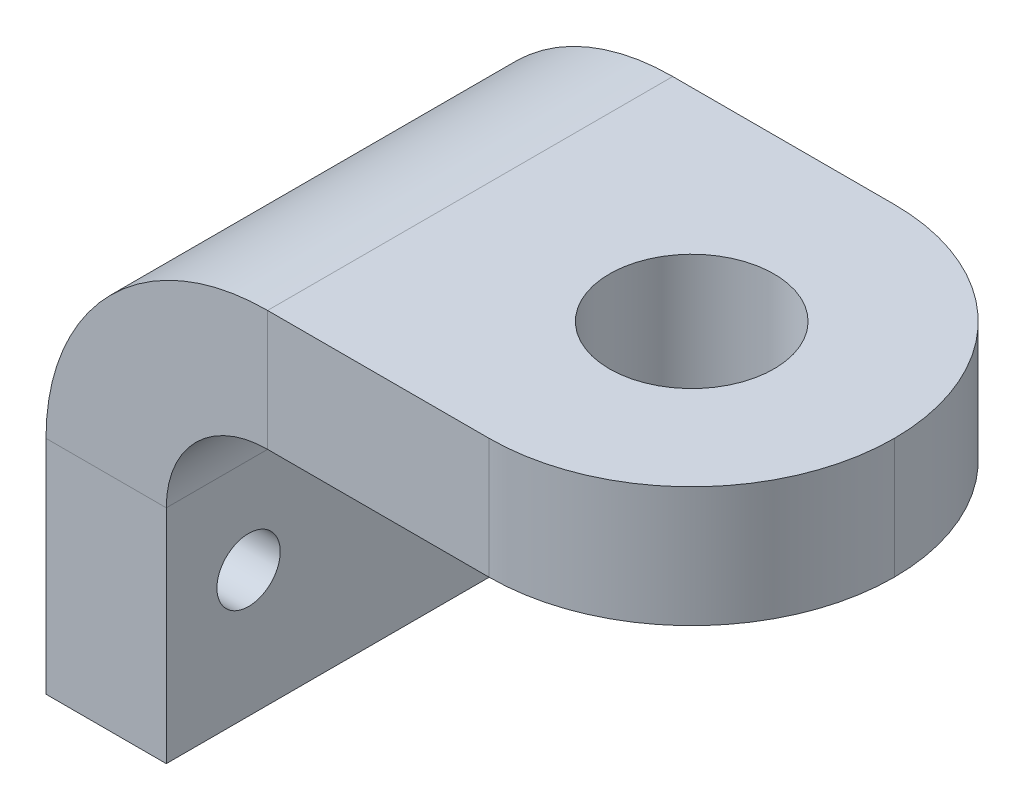
ISO-10303-21;
HEADER;
FILE_DESCRIPTION(('STEP AP214'),'2;1');
FILE_NAME('part.step','',(''),(''),'','','');
FILE_SCHEMA(('AUTOMOTIVE_DESIGN { 1 0 10303 214 1 1 1 1 }'));
ENDSEC;
DATA;
#1=APPLICATION_CONTEXT('core data for automotive mechanical design processes');
#2=APPLICATION_PROTOCOL_DEFINITION('international standard','automotive_design',2000,#1);
#3=PRODUCT_CONTEXT('',#1,'mechanical');
#4=PRODUCT('Part','Part','',(#3));
#5=PRODUCT_RELATED_PRODUCT_CATEGORY('part','',(#4));
#6=PRODUCT_DEFINITION_FORMATION('','',#4);
#7=PRODUCT_DEFINITION_CONTEXT('part definition',#1,'design');
#8=PRODUCT_DEFINITION('design','',#6,#7);
#9=PRODUCT_DEFINITION_SHAPE('','',#8);
#10=(LENGTH_UNIT() NAMED_UNIT(*) SI_UNIT(.MILLI.,.METRE.));
#11=(NAMED_UNIT(*) PLANE_ANGLE_UNIT() SI_UNIT($,.RADIAN.));
#12=(NAMED_UNIT(*) SI_UNIT($,.STERADIAN.) SOLID_ANGLE_UNIT());
#13=UNCERTAINTY_MEASURE_WITH_UNIT(LENGTH_MEASURE(1.E-05),#10,'distance_accuracy_value','');
#14=(GEOMETRIC_REPRESENTATION_CONTEXT(3) GLOBAL_UNCERTAINTY_ASSIGNED_CONTEXT((#13)) GLOBAL_UNIT_ASSIGNED_CONTEXT((#10,
#11,#12)) REPRESENTATION_CONTEXT('',''));
#15=CARTESIAN_POINT('',(0.,0.,0.));
#16=DIRECTION('',(0.,0.,1.));
#17=DIRECTION('',(1.,0.,0.));
#18=AXIS2_PLACEMENT_3D('',#15,#16,#17);
#19=CARTESIAN_POINT('',(0.,51.,64.));
#20=DIRECTION('',(0.,1.,0.));
#21=DIRECTION('',(0.,0.,1.));
#22=AXIS2_PLACEMENT_3D('',#19,#20,#21);
#23=PLANE('',#22);
#24=DIRECTION('',(1.,0.,0.));
#25=VECTOR('',#24,1.);
#26=CARTESIAN_POINT('',(0.,51.,0.));
#27=LINE('',#26,#25);
#28=CARTESIAN_POINT('',(35.,51.,0.));
#29=VERTEX_POINT('',#28);
#30=CARTESIAN_POINT('',(70.,51.,0.));
#31=VERTEX_POINT('',#30);
#32=EDGE_CURVE('E188',#29,#31,#27,.T.);
#33=ORIENTED_EDGE('',*,*,#32,.T.);
#34=CARTESIAN_POINT('',(70.,51.,32.));
#35=DIRECTION('',(0.,1.,0.));
#36=DIRECTION('',(0.,0.,1.));
#37=AXIS2_PLACEMENT_3D('',#34,#35,#36);
#38=CIRCLE('',#37,32.);
#39=CARTESIAN_POINT('',(102.,51.,32.));
#40=VERTEX_POINT('',#39);
#41=EDGE_CURVE('E235',#31,#40,#38,.F.);
#42=ORIENTED_EDGE('',*,*,#41,.T.);
#43=CARTESIAN_POINT('',(70.,51.,32.));
#44=DIRECTION('',(0.,1.,0.));
#45=DIRECTION('',(0.,0.,1.));
#46=AXIS2_PLACEMENT_3D('',#43,#44,#45);
#47=CIRCLE('',#46,32.);
#48=CARTESIAN_POINT('',(70.,51.,64.));
#49=VERTEX_POINT('',#48);
#50=EDGE_CURVE('E232',#40,#49,#47,.F.);
#51=ORIENTED_EDGE('',*,*,#50,.T.);
#52=DIRECTION('',(1.,0.,0.));
#53=VECTOR('',#52,1.);
#54=CARTESIAN_POINT('',(0.,51.,64.));
#55=LINE('',#54,#53);
#56=CARTESIAN_POINT('',(35.,51.,64.));
#57=VERTEX_POINT('',#56);
#58=EDGE_CURVE('E165',#57,#49,#55,.T.);
#59=ORIENTED_EDGE('',*,*,#58,.F.);
#60=DIRECTION('',(0.,0.,-1.));
#61=VECTOR('',#60,1.);
#62=CARTESIAN_POINT('',(35.,51.,64.));
#63=LINE('',#62,#61);
#64=EDGE_CURVE('E187',#57,#29,#63,.T.);
#65=ORIENTED_EDGE('',*,*,#64,.T.);
#66=EDGE_LOOP('',(#33,#42,#51,#59,#65));
#67=FACE_BOUND('',#66,.T.);
#68=CARTESIAN_POINT('',(70.,51.,32.));
#69=DIRECTION('',(0.,1.,0.));
#70=DIRECTION('',(0.,0.,1.));
#71=AXIS2_PLACEMENT_3D('',#68,#69,#70);
#72=CIRCLE('',#71,13.);
#73=CARTESIAN_POINT('',(70.,51.,45.));
#74=VERTEX_POINT('',#73);
#75=EDGE_CURVE('E254',#74,#74,#72,.F.);
#76=ORIENTED_EDGE('',*,*,#75,.F.);
#77=EDGE_LOOP('',(#76));
#78=FACE_BOUND('',#77,.T.);
#79=ADVANCED_FACE('F47',(#67,#78),#23,.F.);
#80=CARTESIAN_POINT('',(35.,70.,64.));
#81=DIRECTION('',(0.,0.,1.));
#82=DIRECTION('',(1.,0.,0.));
#83=AXIS2_PLACEMENT_3D('',#80,#81,#82);
#84=PLANE('',#83);
#85=DIRECTION('',(0.,-1.,0.));
#86=VECTOR('',#85,1.);
#87=CARTESIAN_POINT('',(35.,70.,64.));
#88=LINE('',#87,#86);
#89=CARTESIAN_POINT('',(35.,70.,64.));
#90=VERTEX_POINT('',#89);
#91=EDGE_CURVE('E137',#90,#57,#88,.T.);
#92=ORIENTED_EDGE('',*,*,#91,.F.);
#93=CARTESIAN_POINT('',(35.,35.,64.));
#94=DIRECTION('',(0.,0.,1.));
#95=DIRECTION('',(1.,0.,0.));
#96=AXIS2_PLACEMENT_3D('',#93,#94,#95);
#97=CIRCLE('',#96,35.);
#98=CARTESIAN_POINT('',(0.,35.,64.));
#99=VERTEX_POINT('',#98);
#100=EDGE_CURVE('E141',#99,#90,#97,.F.);
#101=ORIENTED_EDGE('',*,*,#100,.F.);
#102=DIRECTION('',(-1.,0.,0.));
#103=VECTOR('',#102,1.);
#104=CARTESIAN_POINT('',(19.,35.,64.));
#105=LINE('',#104,#103);
#106=CARTESIAN_POINT('',(19.,35.,64.));
#107=VERTEX_POINT('',#106);
#108=EDGE_CURVE('E147',#107,#99,#105,.T.);
#109=ORIENTED_EDGE('',*,*,#108,.F.);
#110=CARTESIAN_POINT('',(35.,35.,64.));
#111=DIRECTION('',(0.,0.,1.));
#112=DIRECTION('',(1.,0.,0.));
#113=AXIS2_PLACEMENT_3D('',#110,#111,#112);
#114=CIRCLE('',#113,16.);
#115=EDGE_CURVE('E144',#107,#57,#114,.F.);
#116=ORIENTED_EDGE('',*,*,#115,.T.);
#117=EDGE_LOOP('',(#92,#101,#109,#116));
#118=FACE_BOUND('',#117,.T.);
#119=ADVANCED_FACE('F139',(#118),#84,.T.);
#120=CARTESIAN_POINT('',(19.,35.,64.));
#121=DIRECTION('',(0.,0.,1.));
#122=DIRECTION('',(1.,0.,0.));
#123=AXIS2_PLACEMENT_3D('',#120,#121,#122);
#124=PLANE('',#123);
#125=ORIENTED_EDGE('',*,*,#58,.T.);
#126=DIRECTION('',(0.,-1.,0.));
#127=VECTOR('',#126,1.);
#128=CARTESIAN_POINT('',(70.,35.,64.));
#129=LINE('',#128,#127);
#130=CARTESIAN_POINT('',(70.,70.,64.));
#131=VERTEX_POINT('',#130);
#132=EDGE_CURVE('E11',#49,#131,#129,.F.);
#133=ORIENTED_EDGE('',*,*,#132,.T.);
#134=DIRECTION('',(1.,0.,0.));
#135=VECTOR('',#134,1.);
#136=CARTESIAN_POINT('',(0.,70.,64.));
#137=LINE('',#136,#135);
#138=EDGE_CURVE('E153',#90,#131,#137,.T.);
#139=ORIENTED_EDGE('',*,*,#138,.F.);
#140=ORIENTED_EDGE('',*,*,#91,.T.);
#141=EDGE_LOOP('',(#125,#133,#139,#140));
#142=FACE_BOUND('',#141,.T.);
#143=ADVANCED_FACE('F163',(#142),#124,.T.);
#144=CARTESIAN_POINT('',(0.,35.,0.));
#145=DIRECTION('',(0.,0.,-1.));
#146=DIRECTION('',(-1.,0.,0.));
#147=AXIS2_PLACEMENT_3D('',#144,#145,#146);
#148=PLANE('',#147);
#149=DIRECTION('',(1.,0.,0.));
#150=VECTOR('',#149,1.);
#151=CARTESIAN_POINT('',(0.,35.,0.));
#152=LINE('',#151,#150);
#153=CARTESIAN_POINT('',(0.,35.,0.));
#154=VERTEX_POINT('',#153);
#155=CARTESIAN_POINT('',(19.,35.,0.));
#156=VERTEX_POINT('',#155);
#157=EDGE_CURVE('E227',#154,#156,#152,.T.);
#158=ORIENTED_EDGE('',*,*,#157,.F.);
#159=CARTESIAN_POINT('',(35.,35.,0.));
#160=DIRECTION('',(0.,0.,1.));
#161=DIRECTION('',(1.,0.,0.));
#162=AXIS2_PLACEMENT_3D('',#159,#160,#161);
#163=CIRCLE('',#162,35.);
#164=CARTESIAN_POINT('',(35.,70.,0.));
#165=VERTEX_POINT('',#164);
#166=EDGE_CURVE('E194',#154,#165,#163,.F.);
#167=ORIENTED_EDGE('',*,*,#166,.T.);
#168=DIRECTION('',(0.,1.,0.));
#169=VECTOR('',#168,1.);
#170=CARTESIAN_POINT('',(35.,51.,0.));
#171=LINE('',#170,#169);
#172=EDGE_CURVE('E160',#29,#165,#171,.T.);
#173=ORIENTED_EDGE('',*,*,#172,.F.);
#174=CARTESIAN_POINT('',(35.,35.,0.));
#175=DIRECTION('',(0.,0.,1.));
#176=DIRECTION('',(1.,0.,0.));
#177=AXIS2_PLACEMENT_3D('',#174,#175,#176);
#178=CIRCLE('',#177,16.);
#179=EDGE_CURVE('E208',#156,#29,#178,.F.);
#180=ORIENTED_EDGE('',*,*,#179,.F.);
#181=EDGE_LOOP('',(#158,#167,#173,#180));
#182=FACE_BOUND('',#181,.T.);
#183=ADVANCED_FACE('F274',(#182),#148,.T.);
#184=CARTESIAN_POINT('',(35.,51.,0.));
#185=DIRECTION('',(0.,0.,-1.));
#186=DIRECTION('',(-1.,0.,0.));
#187=AXIS2_PLACEMENT_3D('',#184,#185,#186);
#188=PLANE('',#187);
#189=DIRECTION('',(0.,1.,0.));
#190=VECTOR('',#189,1.);
#191=CARTESIAN_POINT('',(0.,0.,0.));
#192=LINE('',#191,#190);
#193=CARTESIAN_POINT('',(0.,0.,0.));
#194=VERTEX_POINT('',#193);
#195=EDGE_CURVE('E197',#194,#154,#192,.T.);
#196=ORIENTED_EDGE('',*,*,#195,.T.);
#197=ORIENTED_EDGE('',*,*,#157,.T.);
#198=DIRECTION('',(0.,1.,0.));
#199=VECTOR('',#198,1.);
#200=CARTESIAN_POINT('',(19.,0.,0.));
#201=LINE('',#200,#199);
#202=CARTESIAN_POINT('',(19.,0.,0.));
#203=VERTEX_POINT('',#202);
#204=EDGE_CURVE('E204',#203,#156,#201,.T.);
#205=ORIENTED_EDGE('',*,*,#204,.F.);
#206=DIRECTION('',(-1.,0.,0.));
#207=VECTOR('',#206,1.);
#208=CARTESIAN_POINT('',(19.,0.,0.));
#209=LINE('',#208,#207);
#210=EDGE_CURVE('E201',#203,#194,#209,.T.);
#211=ORIENTED_EDGE('',*,*,#210,.T.);
#212=EDGE_LOOP('',(#196,#197,#205,#211));
#213=FACE_BOUND('',#212,.T.);
#214=ADVANCED_FACE('F277',(#213),#188,.T.);
#215=CARTESIAN_POINT('',(0.,70.,64.));
#216=DIRECTION('',(0.,1.,0.));
#217=DIRECTION('',(0.,0.,1.));
#218=AXIS2_PLACEMENT_3D('',#215,#216,#217);
#219=PLANE('',#218);
#220=CARTESIAN_POINT('',(70.,70.,32.));
#221=DIRECTION('',(0.,1.,0.));
#222=DIRECTION('',(0.,0.,1.));
#223=AXIS2_PLACEMENT_3D('',#220,#221,#222);
#224=CIRCLE('',#223,13.);
#225=CARTESIAN_POINT('',(70.,70.,45.));
#226=VERTEX_POINT('',#225);
#227=EDGE_CURVE('E257',#226,#226,#224,.T.);
#228=ORIENTED_EDGE('',*,*,#227,.F.);
#229=EDGE_LOOP('',(#228));
#230=FACE_BOUND('',#229,.T.);
#231=CARTESIAN_POINT('',(70.,70.,32.));
#232=DIRECTION('',(0.,1.,0.));
#233=DIRECTION('',(0.,0.,1.));
#234=AXIS2_PLACEMENT_3D('',#231,#232,#233);
#235=CIRCLE('',#234,32.);
#236=CARTESIAN_POINT('',(102.,70.,32.));
#237=VERTEX_POINT('',#236);
#238=EDGE_CURVE('E66',#131,#237,#235,.T.);
#239=ORIENTED_EDGE('',*,*,#238,.T.);
#240=CARTESIAN_POINT('',(70.,70.,32.));
#241=DIRECTION('',(0.,1.,0.));
#242=DIRECTION('',(0.,0.,1.));
#243=AXIS2_PLACEMENT_3D('',#240,#241,#242);
#244=CIRCLE('',#243,32.);
#245=CARTESIAN_POINT('',(70.,70.,0.));
#246=VERTEX_POINT('',#245);
#247=EDGE_CURVE('E56',#237,#246,#244,.T.);
#248=ORIENTED_EDGE('',*,*,#247,.T.);
#249=DIRECTION('',(1.,0.,0.));
#250=VECTOR('',#249,1.);
#251=CARTESIAN_POINT('',(0.,70.,0.));
#252=LINE('',#251,#250);
#253=EDGE_CURVE('E155',#165,#246,#252,.T.);
#254=ORIENTED_EDGE('',*,*,#253,.F.);
#255=DIRECTION('',(0.,0.,-1.));
#256=VECTOR('',#255,1.);
#257=CARTESIAN_POINT('',(35.,70.,64.));
#258=LINE('',#257,#256);
#259=EDGE_CURVE('E151',#90,#165,#258,.T.);
#260=ORIENTED_EDGE('',*,*,#259,.F.);
#261=ORIENTED_EDGE('',*,*,#138,.T.);
#262=EDGE_LOOP('',(#239,#248,#254,#260,#261));
#263=FACE_BOUND('',#262,.T.);
#264=ADVANCED_FACE('F152',(#230,#263),#219,.T.);
#265=CARTESIAN_POINT('',(35.,35.,64.));
#266=DIRECTION('',(0.,0.,-1.));
#267=DIRECTION('',(-1.,0.,0.));
#268=AXIS2_PLACEMENT_3D('',#265,#266,#267);
#269=CYLINDRICAL_SURFACE('',#268,35.);
#270=ORIENTED_EDGE('',*,*,#166,.F.);
#271=DIRECTION('',(0.,0.,-1.));
#272=VECTOR('',#271,1.);
#273=CARTESIAN_POINT('',(0.,35.,64.));
#274=LINE('',#273,#272);
#275=EDGE_CURVE('E161',#99,#154,#274,.T.);
#276=ORIENTED_EDGE('',*,*,#275,.F.);
#277=ORIENTED_EDGE('',*,*,#100,.T.);
#278=ORIENTED_EDGE('',*,*,#259,.T.);
#279=EDGE_LOOP('',(#270,#276,#277,#278));
#280=FACE_BOUND('',#279,.T.);
#281=ADVANCED_FACE('F168',(#280),#269,.T.);
#282=CARTESIAN_POINT('',(0.,0.,64.));
#283=DIRECTION('',(-1.,0.,0.));
#284=DIRECTION('',(0.,0.,1.));
#285=AXIS2_PLACEMENT_3D('',#282,#283,#284);
#286=PLANE('',#285);
#287=CARTESIAN_POINT('',(0.,20.,13.));
#288=DIRECTION('',(-1.,0.,0.));
#289=DIRECTION('',(0.,0.,1.));
#290=AXIS2_PLACEMENT_3D('',#287,#288,#289);
#291=CIRCLE('',#290,5.);
#292=CARTESIAN_POINT('',(0.,20.,18.));
#293=VERTEX_POINT('',#292);
#294=EDGE_CURVE('E342',#293,#293,#291,.T.);
#295=ORIENTED_EDGE('',*,*,#294,.F.);
#296=EDGE_LOOP('',(#295));
#297=FACE_BOUND('',#296,.T.);
#298=CARTESIAN_POINT('',(0.,20.,51.));
#299=DIRECTION('',(-1.,0.,0.));
#300=DIRECTION('',(0.,0.,1.));
#301=AXIS2_PLACEMENT_3D('',#298,#299,#300);
#302=CIRCLE('',#301,5.);
#303=CARTESIAN_POINT('',(0.,20.,56.));
#304=VERTEX_POINT('',#303);
#305=EDGE_CURVE('E266',#304,#304,#302,.T.);
#306=ORIENTED_EDGE('',*,*,#305,.F.);
#307=EDGE_LOOP('',(#306));
#308=FACE_BOUND('',#307,.T.);
#309=ORIENTED_EDGE('',*,*,#195,.F.);
#310=DIRECTION('',(0.,0.,-1.));
#311=VECTOR('',#310,1.);
#312=CARTESIAN_POINT('',(0.,0.,64.));
#313=LINE('',#312,#311);
#314=CARTESIAN_POINT('',(0.,0.,64.));
#315=VERTEX_POINT('',#314);
#316=EDGE_CURVE('E221',#315,#194,#313,.T.);
#317=ORIENTED_EDGE('',*,*,#316,.F.);
#318=DIRECTION('',(0.,1.,0.));
#319=VECTOR('',#318,1.);
#320=CARTESIAN_POINT('',(0.,0.,64.));
#321=LINE('',#320,#319);
#322=EDGE_CURVE('E171',#315,#99,#321,.T.);
#323=ORIENTED_EDGE('',*,*,#322,.T.);
#324=ORIENTED_EDGE('',*,*,#275,.T.);
#325=EDGE_LOOP('',(#309,#317,#323,#324));
#326=FACE_BOUND('',#325,.T.);
#327=ADVANCED_FACE('F281',(#297,#308,#326),#286,.T.);
#328=CARTESIAN_POINT('',(19.,0.,64.));
#329=DIRECTION('',(0.,-1.,0.));
#330=DIRECTION('',(0.,0.,-1.));
#331=AXIS2_PLACEMENT_3D('',#328,#329,#330);
#332=PLANE('',#331);
#333=ORIENTED_EDGE('',*,*,#210,.F.);
#334=DIRECTION('',(0.,0.,-1.));
#335=VECTOR('',#334,1.);
#336=CARTESIAN_POINT('',(19.,0.,64.));
#337=LINE('',#336,#335);
#338=CARTESIAN_POINT('',(19.,0.,64.));
#339=VERTEX_POINT('',#338);
#340=EDGE_CURVE('E218',#339,#203,#337,.T.);
#341=ORIENTED_EDGE('',*,*,#340,.F.);
#342=DIRECTION('',(-1.,0.,0.));
#343=VECTOR('',#342,1.);
#344=CARTESIAN_POINT('',(19.,0.,64.));
#345=LINE('',#344,#343);
#346=EDGE_CURVE('E176',#339,#315,#345,.T.);
#347=ORIENTED_EDGE('',*,*,#346,.T.);
#348=ORIENTED_EDGE('',*,*,#316,.T.);
#349=EDGE_LOOP('',(#333,#341,#347,#348));
#350=FACE_BOUND('',#349,.T.);
#351=ADVANCED_FACE('F287',(#350),#332,.T.);
#352=CARTESIAN_POINT('',(19.,0.,64.));
#353=DIRECTION('',(-1.,0.,0.));
#354=DIRECTION('',(0.,0.,1.));
#355=AXIS2_PLACEMENT_3D('',#352,#353,#354);
#356=PLANE('',#355);
#357=CARTESIAN_POINT('',(19.,20.,13.));
#358=DIRECTION('',(-1.,0.,0.));
#359=DIRECTION('',(0.,0.,1.));
#360=AXIS2_PLACEMENT_3D('',#357,#358,#359);
#361=CIRCLE('',#360,5.);
#362=CARTESIAN_POINT('',(19.,20.,18.));
#363=VERTEX_POINT('',#362);
#364=EDGE_CURVE('E339',#363,#363,#361,.F.);
#365=ORIENTED_EDGE('',*,*,#364,.F.);
#366=EDGE_LOOP('',(#365));
#367=FACE_BOUND('',#366,.T.);
#368=CARTESIAN_POINT('',(19.,20.,51.));
#369=DIRECTION('',(-1.,0.,0.));
#370=DIRECTION('',(0.,0.,1.));
#371=AXIS2_PLACEMENT_3D('',#368,#369,#370);
#372=CIRCLE('',#371,5.);
#373=CARTESIAN_POINT('',(19.,20.,56.));
#374=VERTEX_POINT('',#373);
#375=EDGE_CURVE('E263',#374,#374,#372,.F.);
#376=ORIENTED_EDGE('',*,*,#375,.F.);
#377=EDGE_LOOP('',(#376));
#378=FACE_BOUND('',#377,.T.);
#379=ORIENTED_EDGE('',*,*,#204,.T.);
#380=DIRECTION('',(0.,0.,-1.));
#381=VECTOR('',#380,1.);
#382=CARTESIAN_POINT('',(19.,35.,64.));
#383=LINE('',#382,#381);
#384=EDGE_CURVE('E215',#107,#156,#383,.T.);
#385=ORIENTED_EDGE('',*,*,#384,.F.);
#386=DIRECTION('',(0.,1.,0.));
#387=VECTOR('',#386,1.);
#388=CARTESIAN_POINT('',(19.,0.,64.));
#389=LINE('',#388,#387);
#390=EDGE_CURVE('E182',#339,#107,#389,.T.);
#391=ORIENTED_EDGE('',*,*,#390,.F.);
#392=ORIENTED_EDGE('',*,*,#340,.T.);
#393=EDGE_LOOP('',(#379,#385,#391,#392));
#394=FACE_BOUND('',#393,.T.);
#395=ADVANCED_FACE('F290',(#367,#378,#394),#356,.F.);
#396=CARTESIAN_POINT('',(35.,35.,64.));
#397=DIRECTION('',(0.,0.,-1.));
#398=DIRECTION('',(-1.,0.,0.));
#399=AXIS2_PLACEMENT_3D('',#396,#397,#398);
#400=CYLINDRICAL_SURFACE('',#399,16.);
#401=ORIENTED_EDGE('',*,*,#179,.T.);
#402=ORIENTED_EDGE('',*,*,#64,.F.);
#403=ORIENTED_EDGE('',*,*,#115,.F.);
#404=ORIENTED_EDGE('',*,*,#384,.T.);
#405=EDGE_LOOP('',(#401,#402,#403,#404));
#406=FACE_BOUND('',#405,.T.);
#407=ADVANCED_FACE('F270',(#406),#400,.F.);
#408=CARTESIAN_POINT('',(35.,35.,64.));
#409=DIRECTION('',(0.,0.,1.));
#410=DIRECTION('',(1.,0.,0.));
#411=AXIS2_PLACEMENT_3D('',#408,#409,#410);
#412=PLANE('',#411);
#413=ORIENTED_EDGE('',*,*,#390,.T.);
#414=ORIENTED_EDGE('',*,*,#108,.T.);
#415=ORIENTED_EDGE('',*,*,#322,.F.);
#416=ORIENTED_EDGE('',*,*,#346,.F.);
#417=EDGE_LOOP('',(#413,#414,#415,#416));
#418=FACE_BOUND('',#417,.T.);
#419=ADVANCED_FACE('F285',(#418),#412,.T.);
#420=CARTESIAN_POINT('',(35.,35.,0.));
#421=DIRECTION('',(0.,0.,1.));
#422=DIRECTION('',(1.,0.,0.));
#423=AXIS2_PLACEMENT_3D('',#420,#421,#422);
#424=PLANE('',#423);
#425=ORIENTED_EDGE('',*,*,#253,.T.);
#426=DIRECTION('',(0.,-1.,0.));
#427=VECTOR('',#426,1.);
#428=CARTESIAN_POINT('',(70.,51.,0.));
#429=LINE('',#428,#427);
#430=EDGE_CURVE('E146',#246,#31,#429,.T.);
#431=ORIENTED_EDGE('',*,*,#430,.T.);
#432=ORIENTED_EDGE('',*,*,#32,.F.);
#433=ORIENTED_EDGE('',*,*,#172,.T.);
#434=EDGE_LOOP('',(#425,#431,#432,#433));
#435=FACE_BOUND('',#434,.T.);
#436=ADVANCED_FACE('F246',(#435),#424,.F.);
#437=CARTESIAN_POINT('',(70.,70.,32.));
#438=DIRECTION('',(0.,-1.,0.));
#439=DIRECTION('',(0.,0.,-1.));
#440=AXIS2_PLACEMENT_3D('',#437,#438,#439);
#441=CYLINDRICAL_SURFACE('',#440,32.);
#442=DIRECTION('',(0.,-1.,0.));
#443=VECTOR('',#442,1.);
#444=CARTESIAN_POINT('',(102.,70.,32.));
#445=LINE('',#444,#443);
#446=EDGE_CURVE('E51',#237,#40,#445,.T.);
#447=ORIENTED_EDGE('',*,*,#446,.F.);
#448=ORIENTED_EDGE('',*,*,#238,.F.);
#449=ORIENTED_EDGE('',*,*,#132,.F.);
#450=ORIENTED_EDGE('',*,*,#50,.F.);
#451=EDGE_LOOP('',(#447,#448,#449,#450));
#452=FACE_BOUND('',#451,.T.);
#453=ADVANCED_FACE('F49',(#452),#441,.T.);
#454=CARTESIAN_POINT('',(70.,35.,32.));
#455=DIRECTION('',(0.,1.,0.));
#456=DIRECTION('',(0.,0.,1.));
#457=AXIS2_PLACEMENT_3D('',#454,#455,#456);
#458=CYLINDRICAL_SURFACE('',#457,32.);
#459=ORIENTED_EDGE('',*,*,#247,.F.);
#460=ORIENTED_EDGE('',*,*,#446,.T.);
#461=ORIENTED_EDGE('',*,*,#41,.F.);
#462=ORIENTED_EDGE('',*,*,#430,.F.);
#463=EDGE_LOOP('',(#459,#460,#461,#462));
#464=FACE_BOUND('',#463,.T.);
#465=ADVANCED_FACE('F248',(#464),#458,.T.);
#466=CARTESIAN_POINT('',(70.,70.,32.));
#467=DIRECTION('',(0.,1.,0.));
#468=DIRECTION('',(0.,0.,1.));
#469=AXIS2_PLACEMENT_3D('',#466,#467,#468);
#470=CYLINDRICAL_SURFACE('',#469,13.);
#471=ORIENTED_EDGE('',*,*,#75,.T.);
#472=EDGE_LOOP('',(#471));
#473=FACE_BOUND('',#472,.T.);
#474=ORIENTED_EDGE('',*,*,#227,.T.);
#475=EDGE_LOOP('',(#474));
#476=FACE_BOUND('',#475,.T.);
#477=ADVANCED_FACE('F318',(#473,#476),#470,.F.);
#478=CARTESIAN_POINT('',(0.,20.,51.));
#479=DIRECTION('',(-1.,0.,0.));
#480=DIRECTION('',(0.,0.,1.));
#481=AXIS2_PLACEMENT_3D('',#478,#479,#480);
#482=CYLINDRICAL_SURFACE('',#481,5.);
#483=ORIENTED_EDGE('',*,*,#375,.T.);
#484=EDGE_LOOP('',(#483));
#485=FACE_BOUND('',#484,.T.);
#486=ORIENTED_EDGE('',*,*,#305,.T.);
#487=EDGE_LOOP('',(#486));
#488=FACE_BOUND('',#487,.T.);
#489=ADVANCED_FACE('F322',(#485,#488),#482,.F.);
#490=CARTESIAN_POINT('',(0.,20.,13.));
#491=DIRECTION('',(-1.,0.,0.));
#492=DIRECTION('',(0.,0.,1.));
#493=AXIS2_PLACEMENT_3D('',#490,#491,#492);
#494=CYLINDRICAL_SURFACE('',#493,5.);
#495=ORIENTED_EDGE('',*,*,#364,.T.);
#496=EDGE_LOOP('',(#495));
#497=FACE_BOUND('',#496,.T.);
#498=ORIENTED_EDGE('',*,*,#294,.T.);
#499=EDGE_LOOP('',(#498));
#500=FACE_BOUND('',#499,.T.);
#501=ADVANCED_FACE('F332',(#497,#500),#494,.F.);
#502=CLOSED_SHELL('',(#79,#119,#143,#183,#214,#264,#281,#327,#351,#395,#407,#419,#436,#453,#465,
#477,#489,#501));
#503=MANIFOLD_SOLID_BREP('B2',#502);
#504=ADVANCED_BREP_SHAPE_REPRESENTATION('',(#18,#503),#14);
#505=SHAPE_DEFINITION_REPRESENTATION(#9,#504);
ENDSEC;
END-ISO-10303-21;
